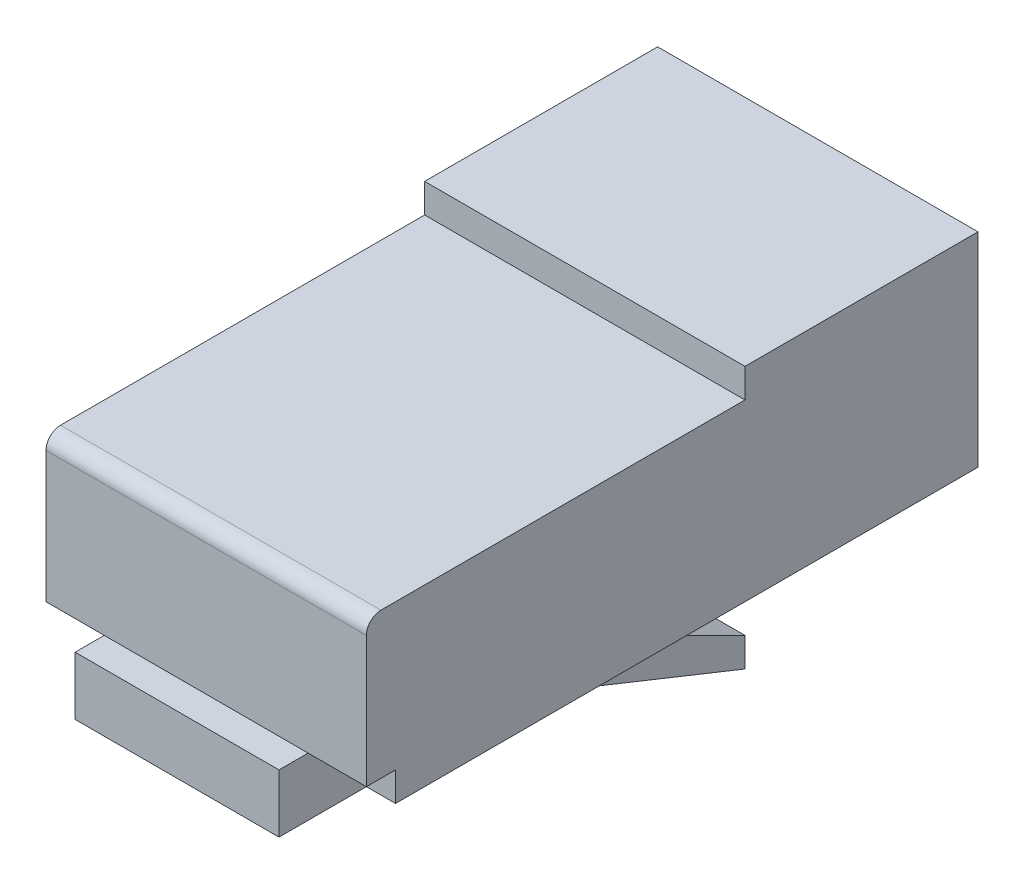
ISO-10303-21;
HEADER;
FILE_DESCRIPTION(('STEP AP214'),'2;1');
FILE_NAME('part.step','',(''),(''),'','','');
FILE_SCHEMA(('AUTOMOTIVE_DESIGN { 1 0 10303 214 1 1 1 1 }'));
ENDSEC;
DATA;
#1=APPLICATION_CONTEXT('core data for automotive mechanical design processes');
#2=APPLICATION_PROTOCOL_DEFINITION('international standard','automotive_design',2000,#1);
#3=PRODUCT_CONTEXT('',#1,'mechanical');
#4=PRODUCT('Part','Part','',(#3));
#5=PRODUCT_RELATED_PRODUCT_CATEGORY('part','',(#4));
#6=PRODUCT_DEFINITION_FORMATION('','',#4);
#7=PRODUCT_DEFINITION_CONTEXT('part definition',#1,'design');
#8=PRODUCT_DEFINITION('design','',#6,#7);
#9=PRODUCT_DEFINITION_SHAPE('','',#8);
#10=(LENGTH_UNIT() NAMED_UNIT(*) SI_UNIT(.MILLI.,.METRE.));
#11=(NAMED_UNIT(*) PLANE_ANGLE_UNIT() SI_UNIT($,.RADIAN.));
#12=(NAMED_UNIT(*) SI_UNIT($,.STERADIAN.) SOLID_ANGLE_UNIT());
#13=UNCERTAINTY_MEASURE_WITH_UNIT(LENGTH_MEASURE(1.E-05),#10,'distance_accuracy_value','');
#14=(GEOMETRIC_REPRESENTATION_CONTEXT(3) GLOBAL_UNCERTAINTY_ASSIGNED_CONTEXT((#13)) GLOBAL_UNIT_ASSIGNED_CONTEXT((#10,
#11,#12)) REPRESENTATION_CONTEXT('',''));
#15=CARTESIAN_POINT('',(0.,0.,0.));
#16=DIRECTION('',(0.,0.,1.));
#17=DIRECTION('',(1.,0.,0.));
#18=AXIS2_PLACEMENT_3D('',#15,#16,#17);
#19=CARTESIAN_POINT('',(2.,-0.5,-1.));
#20=DIRECTION('',(0.,0.,-1.));
#21=DIRECTION('',(-1.,0.,0.));
#22=AXIS2_PLACEMENT_3D('',#19,#20,#21);
#23=PLANE('',#22);
#24=DIRECTION('',(1.,0.,0.));
#25=VECTOR('',#24,1.);
#26=CARTESIAN_POINT('',(2.,-0.5,-1.));
#27=LINE('',#26,#25);
#28=CARTESIAN_POINT('',(2.,-0.5,-1.));
#29=VERTEX_POINT('',#28);
#30=CARTESIAN_POINT('',(3.,-0.5,-1.));
#31=VERTEX_POINT('',#30);
#32=EDGE_CURVE('E352',#29,#31,#27,.T.);
#33=ORIENTED_EDGE('',*,*,#32,.T.);
#34=DIRECTION('',(0.,-1.,0.));
#35=VECTOR('',#34,1.);
#36=CARTESIAN_POINT('',(3.,-2.,-1.));
#37=LINE('',#36,#35);
#38=CARTESIAN_POINT('',(3.,-2.,-1.));
#39=VERTEX_POINT('',#38);
#40=EDGE_CURVE('E272',#31,#39,#37,.T.);
#41=ORIENTED_EDGE('',*,*,#40,.T.);
#42=DIRECTION('',(1.,0.,0.));
#43=VECTOR('',#42,1.);
#44=CARTESIAN_POINT('',(2.,-2.,-1.));
#45=LINE('',#44,#43);
#46=CARTESIAN_POINT('',(2.,-2.,-1.));
#47=VERTEX_POINT('',#46);
#48=EDGE_CURVE('E358',#47,#39,#45,.T.);
#49=ORIENTED_EDGE('',*,*,#48,.F.);
#50=DIRECTION('',(0.,1.,0.));
#51=VECTOR('',#50,1.);
#52=CARTESIAN_POINT('',(2.,-0.5,-1.));
#53=LINE('',#52,#51);
#54=EDGE_CURVE('E333',#47,#29,#53,.T.);
#55=ORIENTED_EDGE('',*,*,#54,.T.);
#56=EDGE_LOOP('',(#33,#41,#49,#55));
#57=FACE_BOUND('',#56,.T.);
#58=ADVANCED_FACE('F35',(#57),#23,.T.);
#59=CARTESIAN_POINT('',(11.,0.,5.));
#60=DIRECTION('',(0.,1.,0.));
#61=DIRECTION('',(0.,0.,1.));
#62=AXIS2_PLACEMENT_3D('',#59,#60,#61);
#63=PLANE('',#62);
#64=DIRECTION('',(0.,0.,-1.));
#65=VECTOR('',#64,1.);
#66=CARTESIAN_POINT('',(2.,0.,5.));
#67=LINE('',#66,#65);
#68=CARTESIAN_POINT('',(2.,0.,4.));
#69=VERTEX_POINT('',#68);
#70=CARTESIAN_POINT('',(2.,0.,2.));
#71=VERTEX_POINT('',#70);
#72=EDGE_CURVE('E355',#69,#71,#67,.T.);
#73=ORIENTED_EDGE('',*,*,#72,.F.);
#74=DIRECTION('',(1.,0.,0.));
#75=VECTOR('',#74,1.);
#76=CARTESIAN_POINT('',(2.,0.,4.));
#77=LINE('',#76,#75);
#78=CARTESIAN_POINT('',(0.,0.,4.));
#79=VERTEX_POINT('',#78);
#80=EDGE_CURVE('E469',#79,#69,#77,.T.);
#81=ORIENTED_EDGE('',*,*,#80,.F.);
#82=DIRECTION('',(0.,0.,-1.));
#83=VECTOR('',#82,1.);
#84=CARTESIAN_POINT('',(0.,0.,5.));
#85=LINE('',#84,#83);
#86=CARTESIAN_POINT('',(0.,0.,-16.));
#87=VERTEX_POINT('',#86);
#88=EDGE_CURVE('E370',#79,#87,#85,.T.);
#89=ORIENTED_EDGE('',*,*,#88,.T.);
#90=DIRECTION('',(-1.,0.,0.));
#91=VECTOR('',#90,1.);
#92=CARTESIAN_POINT('',(11.,0.,-16.));
#93=LINE('',#92,#91);
#94=CARTESIAN_POINT('',(11.,0.,-16.));
#95=VERTEX_POINT('',#94);
#96=EDGE_CURVE('E447',#95,#87,#93,.T.);
#97=ORIENTED_EDGE('',*,*,#96,.F.);
#98=DIRECTION('',(0.,0.,-1.));
#99=VECTOR('',#98,1.);
#100=CARTESIAN_POINT('',(11.,0.,5.));
#101=LINE('',#100,#99);
#102=CARTESIAN_POINT('',(11.,0.,4.));
#103=VERTEX_POINT('',#102);
#104=EDGE_CURVE('E393',#103,#95,#101,.T.);
#105=ORIENTED_EDGE('',*,*,#104,.F.);
#106=DIRECTION('',(1.,0.,0.));
#107=VECTOR('',#106,1.);
#108=CARTESIAN_POINT('',(9.,0.,4.));
#109=LINE('',#108,#107);
#110=CARTESIAN_POINT('',(9.,0.,4.));
#111=VERTEX_POINT('',#110);
#112=EDGE_CURVE('E524',#111,#103,#109,.T.);
#113=ORIENTED_EDGE('',*,*,#112,.F.);
#114=DIRECTION('',(0.,0.,1.));
#115=VECTOR('',#114,1.);
#116=CARTESIAN_POINT('',(9.,0.,5.));
#117=LINE('',#116,#115);
#118=CARTESIAN_POINT('',(9.,0.,2.));
#119=VERTEX_POINT('',#118);
#120=EDGE_CURVE('E511',#119,#111,#117,.T.);
#121=ORIENTED_EDGE('',*,*,#120,.F.);
#122=DIRECTION('',(1.,0.,0.));
#123=VECTOR('',#122,1.);
#124=CARTESIAN_POINT('',(9.,0.,2.));
#125=LINE('',#124,#123);
#126=EDGE_CURVE('E515',#71,#119,#125,.T.);
#127=ORIENTED_EDGE('',*,*,#126,.F.);
#128=EDGE_LOOP('',(#73,#81,#89,#97,#105,#113,#121,#127));
#129=FACE_BOUND('',#128,.T.);
#130=ADVANCED_FACE('F462',(#129),#63,.F.);
#131=CARTESIAN_POINT('',(0.,0.,5.));
#132=DIRECTION('',(0.,0.,-1.));
#133=DIRECTION('',(-1.,0.,0.));
#134=AXIS2_PLACEMENT_3D('',#131,#132,#133);
#135=PLANE('',#134);
#136=DIRECTION('',(0.,1.,0.));
#137=VECTOR('',#136,1.);
#138=CARTESIAN_POINT('',(11.,6.,5.));
#139=LINE('',#138,#137);
#140=CARTESIAN_POINT('',(11.,1.,5.));
#141=VERTEX_POINT('',#140);
#142=CARTESIAN_POINT('',(11.,5.5,5.));
#143=VERTEX_POINT('',#142);
#144=EDGE_CURVE('E386',#141,#143,#139,.T.);
#145=ORIENTED_EDGE('',*,*,#144,.T.);
#146=DIRECTION('',(-1.,0.,0.));
#147=VECTOR('',#146,1.);
#148=CARTESIAN_POINT('',(0.,5.5,5.));
#149=LINE('',#148,#147);
#150=CARTESIAN_POINT('',(0.,5.5,5.));
#151=VERTEX_POINT('',#150);
#152=EDGE_CURVE('E371',#143,#151,#149,.T.);
#153=ORIENTED_EDGE('',*,*,#152,.T.);
#154=DIRECTION('',(0.,-1.,0.));
#155=VECTOR('',#154,1.);
#156=CARTESIAN_POINT('',(0.,6.,5.));
#157=LINE('',#156,#155);
#158=CARTESIAN_POINT('',(0.,1.,5.));
#159=VERTEX_POINT('',#158);
#160=EDGE_CURVE('E382',#151,#159,#157,.T.);
#161=ORIENTED_EDGE('',*,*,#160,.T.);
#162=DIRECTION('',(-1.,0.,0.));
#163=VECTOR('',#162,1.);
#164=CARTESIAN_POINT('',(2.,1.,5.));
#165=LINE('',#164,#163);
#166=CARTESIAN_POINT('',(2.,1.,5.));
#167=VERTEX_POINT('',#166);
#168=EDGE_CURVE('E478',#167,#159,#165,.T.);
#169=ORIENTED_EDGE('',*,*,#168,.F.);
#170=DIRECTION('',(-1.,0.,0.));
#171=VECTOR('',#170,1.);
#172=CARTESIAN_POINT('',(2.,1.,5.));
#173=LINE('',#172,#171);
#174=CARTESIAN_POINT('',(9.,1.,5.));
#175=VERTEX_POINT('',#174);
#176=EDGE_CURVE('E482',#175,#167,#173,.T.);
#177=ORIENTED_EDGE('',*,*,#176,.F.);
#178=DIRECTION('',(-1.,0.,0.));
#179=VECTOR('',#178,1.);
#180=CARTESIAN_POINT('',(9.,1.,5.));
#181=LINE('',#180,#179);
#182=EDGE_CURVE('E510',#141,#175,#181,.T.);
#183=ORIENTED_EDGE('',*,*,#182,.F.);
#184=EDGE_LOOP('',(#145,#153,#161,#169,#177,#183));
#185=FACE_BOUND('',#184,.T.);
#186=ADVANCED_FACE('F380',(#185),#135,.F.);
#187=CARTESIAN_POINT('',(11.,6.,5.));
#188=DIRECTION('',(-1.,0.,0.));
#189=DIRECTION('',(0.,0.,1.));
#190=AXIS2_PLACEMENT_3D('',#187,#188,#189);
#191=PLANE('',#190);
#192=DIRECTION('',(0.,0.,-1.));
#193=VECTOR('',#192,1.);
#194=CARTESIAN_POINT('',(11.,6.,5.));
#195=LINE('',#194,#193);
#196=CARTESIAN_POINT('',(11.,6.,4.5));
#197=VERTEX_POINT('',#196);
#198=CARTESIAN_POINT('',(11.,6.,-8.));
#199=VERTEX_POINT('',#198);
#200=EDGE_CURVE('E369',#197,#199,#195,.T.);
#201=ORIENTED_EDGE('',*,*,#200,.F.);
#202=CARTESIAN_POINT('',(11.,5.5,4.5));
#203=DIRECTION('',(-1.,0.,0.));
#204=DIRECTION('',(0.,0.,1.));
#205=AXIS2_PLACEMENT_3D('',#202,#203,#204);
#206=CIRCLE('',#205,0.5);
#207=EDGE_CURVE('E11',#197,#143,#206,.F.);
#208=ORIENTED_EDGE('',*,*,#207,.T.);
#209=ORIENTED_EDGE('',*,*,#144,.F.);
#210=DIRECTION('',(0.,0.,1.));
#211=VECTOR('',#210,1.);
#212=CARTESIAN_POINT('',(11.,1.,4.));
#213=LINE('',#212,#211);
#214=CARTESIAN_POINT('',(11.,1.,4.));
#215=VERTEX_POINT('',#214);
#216=EDGE_CURVE('E529',#215,#141,#213,.T.);
#217=ORIENTED_EDGE('',*,*,#216,.F.);
#218=DIRECTION('',(0.,1.,0.));
#219=VECTOR('',#218,1.);
#220=CARTESIAN_POINT('',(11.,0.,4.));
#221=LINE('',#220,#219);
#222=EDGE_CURVE('E459',#103,#215,#221,.T.);
#223=ORIENTED_EDGE('',*,*,#222,.F.);
#224=ORIENTED_EDGE('',*,*,#104,.T.);
#225=DIRECTION('',(0.,-1.,0.));
#226=VECTOR('',#225,1.);
#227=CARTESIAN_POINT('',(11.,0.,-16.));
#228=LINE('',#227,#226);
#229=CARTESIAN_POINT('',(11.,7.,-16.));
#230=VERTEX_POINT('',#229);
#231=EDGE_CURVE('E415',#230,#95,#228,.T.);
#232=ORIENTED_EDGE('',*,*,#231,.F.);
#233=DIRECTION('',(0.,0.,1.));
#234=VECTOR('',#233,1.);
#235=CARTESIAN_POINT('',(11.,7.,-16.));
#236=LINE('',#235,#234);
#237=CARTESIAN_POINT('',(11.,7.,-8.));
#238=VERTEX_POINT('',#237);
#239=EDGE_CURVE('E416',#230,#238,#236,.T.);
#240=ORIENTED_EDGE('',*,*,#239,.T.);
#241=DIRECTION('',(0.,-1.,0.));
#242=VECTOR('',#241,1.);
#243=CARTESIAN_POINT('',(11.,0.,-8.));
#244=LINE('',#243,#242);
#245=EDGE_CURVE('E407',#238,#199,#244,.T.);
#246=ORIENTED_EDGE('',*,*,#245,.T.);
#247=EDGE_LOOP('',(#201,#208,#209,#217,#223,#224,#232,#240,#246));
#248=FACE_BOUND('',#247,.T.);
#249=ADVANCED_FACE('F454',(#248),#191,.F.);
#250=CARTESIAN_POINT('',(11.,6.,5.));
#251=DIRECTION('',(0.,-1.,0.));
#252=DIRECTION('',(1.,0.,0.));
#253=AXIS2_PLACEMENT_3D('',#250,#251,#252);
#254=PLANE('',#253);
#255=DIRECTION('',(0.,0.,-1.));
#256=VECTOR('',#255,1.);
#257=CARTESIAN_POINT('',(0.,6.,5.));
#258=LINE('',#257,#256);
#259=CARTESIAN_POINT('',(0.,6.,4.5));
#260=VERTEX_POINT('',#259);
#261=CARTESIAN_POINT('',(0.,6.,-8.));
#262=VERTEX_POINT('',#261);
#263=EDGE_CURVE('E366',#260,#262,#258,.T.);
#264=ORIENTED_EDGE('',*,*,#263,.F.);
#265=DIRECTION('',(-1.,0.,0.));
#266=VECTOR('',#265,1.);
#267=CARTESIAN_POINT('',(11.,6.,4.5));
#268=LINE('',#267,#266);
#269=EDGE_CURVE('E43',#260,#197,#268,.F.);
#270=ORIENTED_EDGE('',*,*,#269,.T.);
#271=ORIENTED_EDGE('',*,*,#200,.T.);
#272=DIRECTION('',(1.,0.,0.));
#273=VECTOR('',#272,1.);
#274=CARTESIAN_POINT('',(11.,6.,-8.));
#275=LINE('',#274,#273);
#276=EDGE_CURVE('E396',#262,#199,#275,.T.);
#277=ORIENTED_EDGE('',*,*,#276,.F.);
#278=EDGE_LOOP('',(#264,#270,#271,#277));
#279=FACE_BOUND('',#278,.T.);
#280=ADVANCED_FACE('F717',(#279),#254,.F.);
#281=CARTESIAN_POINT('',(0.,6.,5.));
#282=DIRECTION('',(1.,0.,0.));
#283=DIRECTION('',(0.,1.,0.));
#284=AXIS2_PLACEMENT_3D('',#281,#282,#283);
#285=PLANE('',#284);
#286=ORIENTED_EDGE('',*,*,#160,.F.);
#287=CARTESIAN_POINT('',(0.,5.5,4.5));
#288=DIRECTION('',(1.,0.,0.));
#289=DIRECTION('',(0.,1.,0.));
#290=AXIS2_PLACEMENT_3D('',#287,#288,#289);
#291=CIRCLE('',#290,0.5);
#292=EDGE_CURVE('E57',#151,#260,#291,.F.);
#293=ORIENTED_EDGE('',*,*,#292,.T.);
#294=ORIENTED_EDGE('',*,*,#263,.T.);
#295=DIRECTION('',(0.,1.,0.));
#296=VECTOR('',#295,1.);
#297=CARTESIAN_POINT('',(0.,0.,-8.));
#298=LINE('',#297,#296);
#299=CARTESIAN_POINT('',(0.,7.,-8.));
#300=VERTEX_POINT('',#299);
#301=EDGE_CURVE('E403',#262,#300,#298,.T.);
#302=ORIENTED_EDGE('',*,*,#301,.T.);
#303=DIRECTION('',(0.,0.,1.));
#304=VECTOR('',#303,1.);
#305=CARTESIAN_POINT('',(0.,7.,-16.));
#306=LINE('',#305,#304);
#307=CARTESIAN_POINT('',(0.,7.,-16.));
#308=VERTEX_POINT('',#307);
#309=EDGE_CURVE('E400',#308,#300,#306,.T.);
#310=ORIENTED_EDGE('',*,*,#309,.F.);
#311=DIRECTION('',(0.,1.,0.));
#312=VECTOR('',#311,1.);
#313=CARTESIAN_POINT('',(0.,0.,-16.));
#314=LINE('',#313,#312);
#315=EDGE_CURVE('E450',#87,#308,#314,.T.);
#316=ORIENTED_EDGE('',*,*,#315,.F.);
#317=ORIENTED_EDGE('',*,*,#88,.F.);
#318=DIRECTION('',(0.,-1.,0.));
#319=VECTOR('',#318,1.);
#320=CARTESIAN_POINT('',(0.,1.,4.));
#321=LINE('',#320,#319);
#322=CARTESIAN_POINT('',(0.,1.,4.));
#323=VERTEX_POINT('',#322);
#324=EDGE_CURVE('E465',#323,#79,#321,.T.);
#325=ORIENTED_EDGE('',*,*,#324,.F.);
#326=DIRECTION('',(0.,0.,1.));
#327=VECTOR('',#326,1.);
#328=CARTESIAN_POINT('',(0.,1.,4.));
#329=LINE('',#328,#327);
#330=EDGE_CURVE('E392',#323,#159,#329,.T.);
#331=ORIENTED_EDGE('',*,*,#330,.T.);
#332=EDGE_LOOP('',(#286,#293,#294,#302,#310,#316,#317,#325,#331));
#333=FACE_BOUND('',#332,.T.);
#334=ADVANCED_FACE('F390',(#333),#285,.F.);
#335=CARTESIAN_POINT('',(11.,7.,-16.));
#336=DIRECTION('',(0.,-1.,0.));
#337=DIRECTION('',(0.,0.,-1.));
#338=AXIS2_PLACEMENT_3D('',#335,#336,#337);
#339=PLANE('',#338);
#340=DIRECTION('',(1.,0.,0.));
#341=VECTOR('',#340,1.);
#342=CARTESIAN_POINT('',(11.,7.,-8.));
#343=LINE('',#342,#341);
#344=EDGE_CURVE('E406',#300,#238,#343,.T.);
#345=ORIENTED_EDGE('',*,*,#344,.T.);
#346=ORIENTED_EDGE('',*,*,#239,.F.);
#347=DIRECTION('',(1.,0.,0.));
#348=VECTOR('',#347,1.);
#349=CARTESIAN_POINT('',(11.,7.,-16.));
#350=LINE('',#349,#348);
#351=EDGE_CURVE('E418',#308,#230,#350,.T.);
#352=ORIENTED_EDGE('',*,*,#351,.F.);
#353=ORIENTED_EDGE('',*,*,#309,.T.);
#354=EDGE_LOOP('',(#345,#346,#352,#353));
#355=FACE_BOUND('',#354,.T.);
#356=ADVANCED_FACE('F424',(#355),#339,.F.);
#357=CARTESIAN_POINT('',(0.,0.,-16.));
#358=DIRECTION('',(0.,0.,1.));
#359=DIRECTION('',(1.,0.,0.));
#360=AXIS2_PLACEMENT_3D('',#357,#358,#359);
#361=PLANE('',#360);
#362=DIRECTION('',(-1.,0.,0.));
#363=VECTOR('',#362,1.);
#364=CARTESIAN_POINT('',(9.,2.,-16.));
#365=LINE('',#364,#363);
#366=CARTESIAN_POINT('',(9.,2.,-16.));
#367=VERTEX_POINT('',#366);
#368=CARTESIAN_POINT('',(2.,2.,-16.));
#369=VERTEX_POINT('',#368);
#370=EDGE_CURVE('E257',#367,#369,#365,.T.);
#371=ORIENTED_EDGE('',*,*,#370,.F.);
#372=DIRECTION('',(0.,-1.,0.));
#373=VECTOR('',#372,1.);
#374=CARTESIAN_POINT('',(9.,2.,-16.));
#375=LINE('',#374,#373);
#376=CARTESIAN_POINT('',(9.,5.,-16.));
#377=VERTEX_POINT('',#376);
#378=EDGE_CURVE('E231',#377,#367,#375,.T.);
#379=ORIENTED_EDGE('',*,*,#378,.F.);
#380=DIRECTION('',(1.,0.,0.));
#381=VECTOR('',#380,1.);
#382=CARTESIAN_POINT('',(9.,5.,-16.));
#383=LINE('',#382,#381);
#384=CARTESIAN_POINT('',(2.,5.,-16.));
#385=VERTEX_POINT('',#384);
#386=EDGE_CURVE('E248',#385,#377,#383,.T.);
#387=ORIENTED_EDGE('',*,*,#386,.F.);
#388=DIRECTION('',(0.,1.,0.));
#389=VECTOR('',#388,1.);
#390=CARTESIAN_POINT('',(2.,2.,-16.));
#391=LINE('',#390,#389);
#392=EDGE_CURVE('E251',#369,#385,#391,.T.);
#393=ORIENTED_EDGE('',*,*,#392,.F.);
#394=EDGE_LOOP('',(#371,#379,#387,#393));
#395=FACE_BOUND('',#394,.T.);
#396=ORIENTED_EDGE('',*,*,#231,.T.);
#397=ORIENTED_EDGE('',*,*,#96,.T.);
#398=ORIENTED_EDGE('',*,*,#315,.T.);
#399=ORIENTED_EDGE('',*,*,#351,.T.);
#400=EDGE_LOOP('',(#396,#397,#398,#399));
#401=FACE_BOUND('',#400,.T.);
#402=ADVANCED_FACE('F452',(#395,#401),#361,.F.);
#403=CARTESIAN_POINT('',(0.,0.,-8.));
#404=DIRECTION('',(0.,0.,1.));
#405=DIRECTION('',(1.,0.,0.));
#406=AXIS2_PLACEMENT_3D('',#403,#404,#405);
#407=PLANE('',#406);
#408=ORIENTED_EDGE('',*,*,#301,.F.);
#409=ORIENTED_EDGE('',*,*,#276,.T.);
#410=ORIENTED_EDGE('',*,*,#245,.F.);
#411=ORIENTED_EDGE('',*,*,#344,.F.);
#412=EDGE_LOOP('',(#408,#409,#410,#411));
#413=FACE_BOUND('',#412,.T.);
#414=ADVANCED_FACE('F430',(#413),#407,.T.);
#415=CARTESIAN_POINT('',(2.,1.,6.));
#416=DIRECTION('',(0.,-1.,0.));
#417=DIRECTION('',(0.,0.,-1.));
#418=AXIS2_PLACEMENT_3D('',#415,#416,#417);
#419=PLANE('',#418);
#420=ORIENTED_EDGE('',*,*,#176,.T.);
#421=DIRECTION('',(0.,0.,-1.));
#422=VECTOR('',#421,1.);
#423=CARTESIAN_POINT('',(2.,1.,6.));
#424=LINE('',#423,#422);
#425=CARTESIAN_POINT('',(2.,1.,6.));
#426=VERTEX_POINT('',#425);
#427=EDGE_CURVE('E433',#426,#167,#424,.T.);
#428=ORIENTED_EDGE('',*,*,#427,.F.);
#429=DIRECTION('',(-1.,0.,0.));
#430=VECTOR('',#429,1.);
#431=CARTESIAN_POINT('',(2.,1.,6.));
#432=LINE('',#431,#430);
#433=CARTESIAN_POINT('',(9.,1.,6.));
#434=VERTEX_POINT('',#433);
#435=EDGE_CURVE('E484',#434,#426,#432,.T.);
#436=ORIENTED_EDGE('',*,*,#435,.F.);
#437=DIRECTION('',(0.,0.,-1.));
#438=VECTOR('',#437,1.);
#439=CARTESIAN_POINT('',(9.,1.,6.));
#440=LINE('',#439,#438);
#441=EDGE_CURVE('E493',#434,#175,#440,.T.);
#442=ORIENTED_EDGE('',*,*,#441,.T.);
#443=EDGE_LOOP('',(#420,#428,#436,#442));
#444=FACE_BOUND('',#443,.T.);
#445=ADVANCED_FACE('F545',(#444),#419,.F.);
#446=CARTESIAN_POINT('',(2.,-1.,6.));
#447=DIRECTION('',(1.,0.,0.));
#448=DIRECTION('',(0.,0.,-1.));
#449=AXIS2_PLACEMENT_3D('',#446,#447,#448);
#450=PLANE('',#449);
#451=ORIENTED_EDGE('',*,*,#427,.T.);
#452=DIRECTION('',(0.,0.,1.));
#453=VECTOR('',#452,1.);
#454=CARTESIAN_POINT('',(2.,1.,4.));
#455=LINE('',#454,#453);
#456=CARTESIAN_POINT('',(2.,1.,4.));
#457=VERTEX_POINT('',#456);
#458=EDGE_CURVE('E472',#457,#167,#455,.T.);
#459=ORIENTED_EDGE('',*,*,#458,.F.);
#460=DIRECTION('',(0.,1.,0.));
#461=VECTOR('',#460,1.);
#462=CARTESIAN_POINT('',(2.,1.,4.));
#463=LINE('',#462,#461);
#464=EDGE_CURVE('E474',#69,#457,#463,.T.);
#465=ORIENTED_EDGE('',*,*,#464,.F.);
#466=ORIENTED_EDGE('',*,*,#72,.T.);
#467=DIRECTION('',(0.,0.164398987305357,0.986393923832144));
#468=VECTOR('',#467,1.);
#469=CARTESIAN_POINT('',(2.,0.,2.));
#470=LINE('',#469,#468);
#471=EDGE_CURVE('E336',#29,#71,#470,.T.);
#472=ORIENTED_EDGE('',*,*,#471,.F.);
#473=ORIENTED_EDGE('',*,*,#54,.F.);
#474=DIRECTION('',(0.,-0.447213595499958,-0.894427190999916));
#475=VECTOR('',#474,1.);
#476=CARTESIAN_POINT('',(2.,-2.,-1.));
#477=LINE('',#476,#475);
#478=CARTESIAN_POINT('',(2.,-1.5,0.));
#479=VERTEX_POINT('',#478);
#480=EDGE_CURVE('E329',#479,#47,#477,.T.);
#481=ORIENTED_EDGE('',*,*,#480,.F.);
#482=DIRECTION('',(0.,-0.242535625036333,-0.970142500145332));
#483=VECTOR('',#482,1.);
#484=CARTESIAN_POINT('',(2.,-1.5,0.));
#485=LINE('',#484,#483);
#486=CARTESIAN_POINT('',(2.,-1.,2.));
#487=VERTEX_POINT('',#486);
#488=EDGE_CURVE('E326',#487,#479,#485,.T.);
#489=ORIENTED_EDGE('',*,*,#488,.F.);
#490=DIRECTION('',(0.,0.,-1.));
#491=VECTOR('',#490,1.);
#492=CARTESIAN_POINT('',(2.,-1.,6.));
#493=LINE('',#492,#491);
#494=CARTESIAN_POINT('',(2.,-1.,6.));
#495=VERTEX_POINT('',#494);
#496=EDGE_CURVE('E435',#495,#487,#493,.T.);
#497=ORIENTED_EDGE('',*,*,#496,.F.);
#498=DIRECTION('',(0.,-1.,0.));
#499=VECTOR('',#498,1.);
#500=CARTESIAN_POINT('',(2.,-1.,6.));
#501=LINE('',#500,#499);
#502=EDGE_CURVE('E487',#426,#495,#501,.T.);
#503=ORIENTED_EDGE('',*,*,#502,.F.);
#504=EDGE_LOOP('',(#451,#459,#465,#466,#472,#473,#481,#489,#497,#503));
#505=FACE_BOUND('',#504,.T.);
#506=ADVANCED_FACE('F537',(#505),#450,.F.);
#507=CARTESIAN_POINT('',(9.,-1.,6.));
#508=DIRECTION('',(0.,1.,0.));
#509=DIRECTION('',(-1.,0.,0.));
#510=AXIS2_PLACEMENT_3D('',#507,#508,#509);
#511=PLANE('',#510);
#512=ORIENTED_EDGE('',*,*,#496,.T.);
#513=DIRECTION('',(1.,0.,0.));
#514=VECTOR('',#513,1.);
#515=CARTESIAN_POINT('',(9.,-1.,2.));
#516=LINE('',#515,#514);
#517=CARTESIAN_POINT('',(9.,-1.,2.));
#518=VERTEX_POINT('',#517);
#519=EDGE_CURVE('E505',#487,#518,#516,.T.);
#520=ORIENTED_EDGE('',*,*,#519,.T.);
#521=DIRECTION('',(0.,0.,-1.));
#522=VECTOR('',#521,1.);
#523=CARTESIAN_POINT('',(9.,-1.,6.));
#524=LINE('',#523,#522);
#525=CARTESIAN_POINT('',(9.,-1.,6.));
#526=VERTEX_POINT('',#525);
#527=EDGE_CURVE('E441',#526,#518,#524,.T.);
#528=ORIENTED_EDGE('',*,*,#527,.F.);
#529=DIRECTION('',(1.,0.,0.));
#530=VECTOR('',#529,1.);
#531=CARTESIAN_POINT('',(9.,-1.,6.));
#532=LINE('',#531,#530);
#533=EDGE_CURVE('E489',#495,#526,#532,.T.);
#534=ORIENTED_EDGE('',*,*,#533,.F.);
#535=EDGE_LOOP('',(#512,#520,#528,#534));
#536=FACE_BOUND('',#535,.T.);
#537=ADVANCED_FACE('F506',(#536),#511,.F.);
#538=CARTESIAN_POINT('',(9.,1.,6.));
#539=DIRECTION('',(-1.,0.,0.));
#540=DIRECTION('',(0.,0.,1.));
#541=AXIS2_PLACEMENT_3D('',#538,#539,#540);
#542=PLANE('',#541);
#543=ORIENTED_EDGE('',*,*,#527,.T.);
#544=DIRECTION('',(0.,-0.242535625036333,-0.970142500145332));
#545=VECTOR('',#544,1.);
#546=CARTESIAN_POINT('',(9.,-1.5,0.));
#547=LINE('',#546,#545);
#548=CARTESIAN_POINT('',(9.,-1.5,0.));
#549=VERTEX_POINT('',#548);
#550=EDGE_CURVE('E294',#518,#549,#547,.T.);
#551=ORIENTED_EDGE('',*,*,#550,.T.);
#552=DIRECTION('',(0.,-0.447213595499958,-0.894427190999916));
#553=VECTOR('',#552,1.);
#554=CARTESIAN_POINT('',(9.,-2.,-1.));
#555=LINE('',#554,#553);
#556=CARTESIAN_POINT('',(9.,-2.,-1.));
#557=VERTEX_POINT('',#556);
#558=EDGE_CURVE('E341',#549,#557,#555,.T.);
#559=ORIENTED_EDGE('',*,*,#558,.T.);
#560=DIRECTION('',(0.,1.,0.));
#561=VECTOR('',#560,1.);
#562=CARTESIAN_POINT('',(9.,-0.5,-1.));
#563=LINE('',#562,#561);
#564=CARTESIAN_POINT('',(9.,-0.5,-1.));
#565=VERTEX_POINT('',#564);
#566=EDGE_CURVE('E344',#557,#565,#563,.T.);
#567=ORIENTED_EDGE('',*,*,#566,.T.);
#568=DIRECTION('',(0.,0.164398987305357,0.986393923832144));
#569=VECTOR('',#568,1.);
#570=CARTESIAN_POINT('',(9.,0.,2.));
#571=LINE('',#570,#569);
#572=EDGE_CURVE('E330',#565,#119,#571,.T.);
#573=ORIENTED_EDGE('',*,*,#572,.T.);
#574=ORIENTED_EDGE('',*,*,#120,.T.);
#575=DIRECTION('',(0.,-1.,0.));
#576=VECTOR('',#575,1.);
#577=CARTESIAN_POINT('',(9.,0.,4.));
#578=LINE('',#577,#576);
#579=CARTESIAN_POINT('',(9.,1.,4.));
#580=VERTEX_POINT('',#579);
#581=EDGE_CURVE('E513',#580,#111,#578,.T.);
#582=ORIENTED_EDGE('',*,*,#581,.F.);
#583=DIRECTION('',(0.,0.,1.));
#584=VECTOR('',#583,1.);
#585=CARTESIAN_POINT('',(9.,1.,4.));
#586=LINE('',#585,#584);
#587=EDGE_CURVE('E480',#580,#175,#586,.T.);
#588=ORIENTED_EDGE('',*,*,#587,.T.);
#589=ORIENTED_EDGE('',*,*,#441,.F.);
#590=DIRECTION('',(0.,1.,0.));
#591=VECTOR('',#590,1.);
#592=CARTESIAN_POINT('',(9.,1.,6.));
#593=LINE('',#592,#591);
#594=EDGE_CURVE('E491',#526,#434,#593,.T.);
#595=ORIENTED_EDGE('',*,*,#594,.F.);
#596=EDGE_LOOP('',(#543,#551,#559,#567,#573,#574,#582,#588,#589,#595));
#597=FACE_BOUND('',#596,.T.);
#598=ADVANCED_FACE('F501',(#597),#542,.F.);
#599=CARTESIAN_POINT('',(0.,0.,6.));
#600=DIRECTION('',(0.,0.,-1.));
#601=DIRECTION('',(-1.,0.,0.));
#602=AXIS2_PLACEMENT_3D('',#599,#600,#601);
#603=PLANE('',#602);
#604=ORIENTED_EDGE('',*,*,#435,.T.);
#605=ORIENTED_EDGE('',*,*,#502,.T.);
#606=ORIENTED_EDGE('',*,*,#533,.T.);
#607=ORIENTED_EDGE('',*,*,#594,.T.);
#608=EDGE_LOOP('',(#604,#605,#606,#607));
#609=FACE_BOUND('',#608,.T.);
#610=ADVANCED_FACE('F751',(#609),#603,.F.);
#611=CARTESIAN_POINT('',(2.,1.,4.));
#612=DIRECTION('',(0.,1.,0.));
#613=DIRECTION('',(0.,0.,1.));
#614=AXIS2_PLACEMENT_3D('',#611,#612,#613);
#615=PLANE('',#614);
#616=ORIENTED_EDGE('',*,*,#168,.T.);
#617=ORIENTED_EDGE('',*,*,#330,.F.);
#618=DIRECTION('',(-1.,0.,0.));
#619=VECTOR('',#618,1.);
#620=CARTESIAN_POINT('',(2.,1.,4.));
#621=LINE('',#620,#619);
#622=EDGE_CURVE('E470',#457,#323,#621,.T.);
#623=ORIENTED_EDGE('',*,*,#622,.F.);
#624=ORIENTED_EDGE('',*,*,#458,.T.);
#625=EDGE_LOOP('',(#616,#617,#623,#624));
#626=FACE_BOUND('',#625,.T.);
#627=ADVANCED_FACE('F541',(#626),#615,.F.);
#628=CARTESIAN_POINT('',(0.,0.,4.));
#629=DIRECTION('',(0.,0.,-1.));
#630=DIRECTION('',(-1.,0.,0.));
#631=AXIS2_PLACEMENT_3D('',#628,#629,#630);
#632=PLANE('',#631);
#633=ORIENTED_EDGE('',*,*,#464,.T.);
#634=ORIENTED_EDGE('',*,*,#622,.T.);
#635=ORIENTED_EDGE('',*,*,#324,.T.);
#636=ORIENTED_EDGE('',*,*,#80,.T.);
#637=EDGE_LOOP('',(#633,#634,#635,#636));
#638=FACE_BOUND('',#637,.T.);
#639=ADVANCED_FACE('F535',(#638),#632,.F.);
#640=CARTESIAN_POINT('',(9.,1.,4.));
#641=DIRECTION('',(0.,1.,0.));
#642=DIRECTION('',(0.,0.,1.));
#643=AXIS2_PLACEMENT_3D('',#640,#641,#642);
#644=PLANE('',#643);
#645=ORIENTED_EDGE('',*,*,#182,.T.);
#646=ORIENTED_EDGE('',*,*,#587,.F.);
#647=DIRECTION('',(-1.,0.,0.));
#648=VECTOR('',#647,1.);
#649=CARTESIAN_POINT('',(9.,1.,4.));
#650=LINE('',#649,#648);
#651=EDGE_CURVE('E527',#215,#580,#650,.T.);
#652=ORIENTED_EDGE('',*,*,#651,.F.);
#653=ORIENTED_EDGE('',*,*,#216,.T.);
#654=EDGE_LOOP('',(#645,#646,#652,#653));
#655=FACE_BOUND('',#654,.T.);
#656=ADVANCED_FACE('F549',(#655),#644,.F.);
#657=CARTESIAN_POINT('',(0.,0.,4.));
#658=DIRECTION('',(0.,0.,-1.));
#659=DIRECTION('',(-1.,0.,0.));
#660=AXIS2_PLACEMENT_3D('',#657,#658,#659);
#661=PLANE('',#660);
#662=ORIENTED_EDGE('',*,*,#581,.T.);
#663=ORIENTED_EDGE('',*,*,#112,.T.);
#664=ORIENTED_EDGE('',*,*,#222,.T.);
#665=ORIENTED_EDGE('',*,*,#651,.T.);
#666=EDGE_LOOP('',(#662,#663,#664,#665));
#667=FACE_BOUND('',#666,.T.);
#668=ADVANCED_FACE('F576',(#667),#661,.F.);
#669=CARTESIAN_POINT('',(2.,0.,2.));
#670=DIRECTION('',(0.,0.986393923832144,-0.164398987305357));
#671=DIRECTION('',(0.,0.164398987305357,0.986393923832144));
#672=AXIS2_PLACEMENT_3D('',#669,#670,#671);
#673=PLANE('',#672);
#674=ORIENTED_EDGE('',*,*,#572,.F.);
#675=CARTESIAN_POINT('',(8.,-0.5,-1.));
#676=VERTEX_POINT('',#675);
#677=EDGE_CURVE('E278',#676,#565,#27,.T.);
#678=ORIENTED_EDGE('',*,*,#677,.F.);
#679=DIRECTION('',(1.,0.,0.));
#680=VECTOR('',#679,1.);
#681=CARTESIAN_POINT('',(3.,-0.5,-1.));
#682=LINE('',#681,#680);
#683=EDGE_CURVE('E292',#31,#676,#682,.T.);
#684=ORIENTED_EDGE('',*,*,#683,.F.);
#685=ORIENTED_EDGE('',*,*,#32,.F.);
#686=ORIENTED_EDGE('',*,*,#471,.T.);
#687=ORIENTED_EDGE('',*,*,#126,.T.);
#688=EDGE_LOOP('',(#674,#678,#684,#685,#686,#687));
#689=FACE_BOUND('',#688,.T.);
#690=ADVANCED_FACE('F569',(#689),#673,.T.);
#691=DIRECTION('',(0.,-1.,0.));
#692=VECTOR('',#691,1.);
#693=CARTESIAN_POINT('',(8.,-2.,-1.));
#694=LINE('',#693,#692);
#695=CARTESIAN_POINT('',(8.,-2.,-1.));
#696=VERTEX_POINT('',#695);
#697=EDGE_CURVE('E263',#676,#696,#694,.T.);
#698=ORIENTED_EDGE('',*,*,#697,.F.);
#699=ORIENTED_EDGE('',*,*,#677,.T.);
#700=ORIENTED_EDGE('',*,*,#566,.F.);
#701=EDGE_CURVE('E356',#696,#557,#45,.T.);
#702=ORIENTED_EDGE('',*,*,#701,.F.);
#703=EDGE_LOOP('',(#698,#699,#700,#702));
#704=FACE_BOUND('',#703,.T.);
#705=ADVANCED_FACE('F558',(#704),#23,.T.);
#706=CARTESIAN_POINT('',(2.,-2.,-1.));
#707=DIRECTION('',(0.,-0.894427190999916,0.447213595499958));
#708=DIRECTION('',(0.,-0.447213595499958,-0.894427190999916));
#709=AXIS2_PLACEMENT_3D('',#706,#707,#708);
#710=PLANE('',#709);
#711=ORIENTED_EDGE('',*,*,#558,.F.);
#712=DIRECTION('',(1.,0.,0.));
#713=VECTOR('',#712,1.);
#714=CARTESIAN_POINT('',(2.,-1.5,0.));
#715=LINE('',#714,#713);
#716=EDGE_CURVE('E338',#479,#549,#715,.T.);
#717=ORIENTED_EDGE('',*,*,#716,.F.);
#718=ORIENTED_EDGE('',*,*,#480,.T.);
#719=ORIENTED_EDGE('',*,*,#48,.T.);
#720=DIRECTION('',(1.,0.,0.));
#721=VECTOR('',#720,1.);
#722=CARTESIAN_POINT('',(3.,-2.,-1.));
#723=LINE('',#722,#721);
#724=EDGE_CURVE('E285',#39,#696,#723,.T.);
#725=ORIENTED_EDGE('',*,*,#724,.T.);
#726=ORIENTED_EDGE('',*,*,#701,.T.);
#727=EDGE_LOOP('',(#711,#717,#718,#719,#725,#726));
#728=FACE_BOUND('',#727,.T.);
#729=ADVANCED_FACE('F568',(#728),#710,.T.);
#730=CARTESIAN_POINT('',(2.,-1.5,0.));
#731=DIRECTION('',(0.,-0.970142500145332,0.242535625036333));
#732=DIRECTION('',(0.,-0.242535625036333,-0.970142500145332));
#733=AXIS2_PLACEMENT_3D('',#730,#731,#732);
#734=PLANE('',#733);
#735=ORIENTED_EDGE('',*,*,#550,.F.);
#736=ORIENTED_EDGE('',*,*,#519,.F.);
#737=ORIENTED_EDGE('',*,*,#488,.T.);
#738=ORIENTED_EDGE('',*,*,#716,.T.);
#739=EDGE_LOOP('',(#735,#736,#737,#738));
#740=FACE_BOUND('',#739,.T.);
#741=ADVANCED_FACE('F574',(#740),#734,.T.);
#742=CARTESIAN_POINT('',(3.,-0.5,-1.));
#743=DIRECTION('',(0.,0.98058067569092,-0.196116135138184));
#744=DIRECTION('',(0.,0.196116135138184,0.98058067569092));
#745=AXIS2_PLACEMENT_3D('',#742,#743,#744);
#746=PLANE('',#745);
#747=DIRECTION('',(0.,0.196116135138184,0.98058067569092));
#748=VECTOR('',#747,1.);
#749=CARTESIAN_POINT('',(8.,-0.5,-1.));
#750=LINE('',#749,#748);
#751=CARTESIAN_POINT('',(8.,-1.5,-6.));
#752=VERTEX_POINT('',#751);
#753=EDGE_CURVE('E277',#752,#676,#750,.T.);
#754=ORIENTED_EDGE('',*,*,#753,.F.);
#755=DIRECTION('',(1.,0.,0.));
#756=VECTOR('',#755,1.);
#757=CARTESIAN_POINT('',(3.,-1.5,-6.));
#758=LINE('',#757,#756);
#759=CARTESIAN_POINT('',(3.,-1.5,-6.));
#760=VERTEX_POINT('',#759);
#761=EDGE_CURVE('E295',#760,#752,#758,.T.);
#762=ORIENTED_EDGE('',*,*,#761,.F.);
#763=DIRECTION('',(0.,0.196116135138184,0.98058067569092));
#764=VECTOR('',#763,1.);
#765=CARTESIAN_POINT('',(3.,-0.5,-1.));
#766=LINE('',#765,#764);
#767=EDGE_CURVE('E289',#760,#31,#766,.T.);
#768=ORIENTED_EDGE('',*,*,#767,.T.);
#769=ORIENTED_EDGE('',*,*,#683,.T.);
#770=EDGE_LOOP('',(#754,#762,#768,#769));
#771=FACE_BOUND('',#770,.T.);
#772=ADVANCED_FACE('F601',(#771),#746,.T.);
#773=CARTESIAN_POINT('',(3.,-1.5,-6.));
#774=DIRECTION('',(0.,0.894427190999916,-0.447213595499958));
#775=DIRECTION('',(0.,0.447213595499958,0.894427190999916));
#776=AXIS2_PLACEMENT_3D('',#773,#774,#775);
#777=PLANE('',#776);
#778=DIRECTION('',(0.,0.447213595499958,0.894427190999916));
#779=VECTOR('',#778,1.);
#780=CARTESIAN_POINT('',(8.,-1.5,-6.));
#781=LINE('',#780,#779);
#782=CARTESIAN_POINT('',(8.,-4.,-11.));
#783=VERTEX_POINT('',#782);
#784=EDGE_CURVE('E317',#783,#752,#781,.T.);
#785=ORIENTED_EDGE('',*,*,#784,.F.);
#786=DIRECTION('',(1.,0.,0.));
#787=VECTOR('',#786,1.);
#788=CARTESIAN_POINT('',(3.,-4.,-11.));
#789=LINE('',#788,#787);
#790=CARTESIAN_POINT('',(3.,-4.,-11.));
#791=VERTEX_POINT('',#790);
#792=EDGE_CURVE('E321',#791,#783,#789,.T.);
#793=ORIENTED_EDGE('',*,*,#792,.F.);
#794=DIRECTION('',(0.,0.447213595499958,0.894427190999916));
#795=VECTOR('',#794,1.);
#796=CARTESIAN_POINT('',(3.,-1.5,-6.));
#797=LINE('',#796,#795);
#798=EDGE_CURVE('E300',#791,#760,#797,.T.);
#799=ORIENTED_EDGE('',*,*,#798,.T.);
#800=ORIENTED_EDGE('',*,*,#761,.T.);
#801=EDGE_LOOP('',(#785,#793,#799,#800));
#802=FACE_BOUND('',#801,.T.);
#803=ADVANCED_FACE('F605',(#802),#777,.T.);
#804=CARTESIAN_POINT('',(3.,-4.,-11.));
#805=DIRECTION('',(0.,0.,-1.));
#806=DIRECTION('',(-1.,0.,0.));
#807=AXIS2_PLACEMENT_3D('',#804,#805,#806);
#808=PLANE('',#807);
#809=DIRECTION('',(0.,1.,0.));
#810=VECTOR('',#809,1.);
#811=CARTESIAN_POINT('',(8.,-4.,-11.));
#812=LINE('',#811,#810);
#813=CARTESIAN_POINT('',(8.,-5.,-11.));
#814=VERTEX_POINT('',#813);
#815=EDGE_CURVE('E314',#814,#783,#812,.T.);
#816=ORIENTED_EDGE('',*,*,#815,.F.);
#817=DIRECTION('',(1.,0.,0.));
#818=VECTOR('',#817,1.);
#819=CARTESIAN_POINT('',(3.,-5.,-11.));
#820=LINE('',#819,#818);
#821=CARTESIAN_POINT('',(3.,-5.,-11.));
#822=VERTEX_POINT('',#821);
#823=EDGE_CURVE('E323',#822,#814,#820,.T.);
#824=ORIENTED_EDGE('',*,*,#823,.F.);
#825=DIRECTION('',(0.,1.,0.));
#826=VECTOR('',#825,1.);
#827=CARTESIAN_POINT('',(3.,-4.,-11.));
#828=LINE('',#827,#826);
#829=EDGE_CURVE('E608',#822,#791,#828,.T.);
#830=ORIENTED_EDGE('',*,*,#829,.T.);
#831=ORIENTED_EDGE('',*,*,#792,.T.);
#832=EDGE_LOOP('',(#816,#824,#830,#831));
#833=FACE_BOUND('',#832,.T.);
#834=ADVANCED_FACE('F633',(#833),#808,.T.);
#835=CARTESIAN_POINT('',(3.,-5.,-11.));
#836=DIRECTION('',(0.,-0.928476690885259,0.371390676354104));
#837=DIRECTION('',(0.,-0.371390676354104,-0.928476690885259));
#838=AXIS2_PLACEMENT_3D('',#835,#836,#837);
#839=PLANE('',#838);
#840=DIRECTION('',(0.,-0.371390676354104,-0.928476690885259));
#841=VECTOR('',#840,1.);
#842=CARTESIAN_POINT('',(8.,-5.,-11.));
#843=LINE('',#842,#841);
#844=CARTESIAN_POINT('',(8.,-3.,-6.));
#845=VERTEX_POINT('',#844);
#846=EDGE_CURVE('E311',#845,#814,#843,.T.);
#847=ORIENTED_EDGE('',*,*,#846,.F.);
#848=DIRECTION('',(1.,0.,0.));
#849=VECTOR('',#848,1.);
#850=CARTESIAN_POINT('',(3.,-3.,-6.));
#851=LINE('',#850,#849);
#852=CARTESIAN_POINT('',(3.,-3.,-6.));
#853=VERTEX_POINT('',#852);
#854=EDGE_CURVE('E288',#853,#845,#851,.T.);
#855=ORIENTED_EDGE('',*,*,#854,.F.);
#856=DIRECTION('',(0.,-0.371390676354104,-0.928476690885259));
#857=VECTOR('',#856,1.);
#858=CARTESIAN_POINT('',(3.,-5.,-11.));
#859=LINE('',#858,#857);
#860=EDGE_CURVE('E269',#853,#822,#859,.T.);
#861=ORIENTED_EDGE('',*,*,#860,.T.);
#862=ORIENTED_EDGE('',*,*,#823,.T.);
#863=EDGE_LOOP('',(#847,#855,#861,#862));
#864=FACE_BOUND('',#863,.T.);
#865=ADVANCED_FACE('F613',(#864),#839,.T.);
#866=CARTESIAN_POINT('',(3.,-3.,-6.));
#867=DIRECTION('',(0.,-0.98058067569092,0.196116135138184));
#868=DIRECTION('',(0.,-0.196116135138184,-0.98058067569092));
#869=AXIS2_PLACEMENT_3D('',#866,#867,#868);
#870=PLANE('',#869);
#871=DIRECTION('',(0.,-0.196116135138184,-0.98058067569092));
#872=VECTOR('',#871,1.);
#873=CARTESIAN_POINT('',(8.,-3.,-6.));
#874=LINE('',#873,#872);
#875=EDGE_CURVE('E306',#696,#845,#874,.T.);
#876=ORIENTED_EDGE('',*,*,#875,.F.);
#877=ORIENTED_EDGE('',*,*,#724,.F.);
#878=DIRECTION('',(0.,-0.196116135138184,-0.98058067569092));
#879=VECTOR('',#878,1.);
#880=CARTESIAN_POINT('',(3.,-3.,-6.));
#881=LINE('',#880,#879);
#882=EDGE_CURVE('E276',#39,#853,#881,.T.);
#883=ORIENTED_EDGE('',*,*,#882,.T.);
#884=ORIENTED_EDGE('',*,*,#854,.T.);
#885=EDGE_LOOP('',(#876,#877,#883,#884));
#886=FACE_BOUND('',#885,.T.);
#887=ADVANCED_FACE('F592',(#886),#870,.T.);
#888=CARTESIAN_POINT('',(3.,0.,0.));
#889=DIRECTION('',(-1.,0.,0.));
#890=DIRECTION('',(0.,0.,1.));
#891=AXIS2_PLACEMENT_3D('',#888,#889,#890);
#892=PLANE('',#891);
#893=ORIENTED_EDGE('',*,*,#40,.F.);
#894=ORIENTED_EDGE('',*,*,#767,.F.);
#895=ORIENTED_EDGE('',*,*,#798,.F.);
#896=ORIENTED_EDGE('',*,*,#829,.F.);
#897=ORIENTED_EDGE('',*,*,#860,.F.);
#898=ORIENTED_EDGE('',*,*,#882,.F.);
#899=EDGE_LOOP('',(#893,#894,#895,#896,#897,#898));
#900=FACE_BOUND('',#899,.T.);
#901=ADVANCED_FACE('F596',(#900),#892,.T.);
#902=CARTESIAN_POINT('',(8.,0.,0.));
#903=DIRECTION('',(-1.,0.,0.));
#904=DIRECTION('',(0.,0.,1.));
#905=AXIS2_PLACEMENT_3D('',#902,#903,#904);
#906=PLANE('',#905);
#907=ORIENTED_EDGE('',*,*,#697,.T.);
#908=ORIENTED_EDGE('',*,*,#875,.T.);
#909=ORIENTED_EDGE('',*,*,#846,.T.);
#910=ORIENTED_EDGE('',*,*,#815,.T.);
#911=ORIENTED_EDGE('',*,*,#784,.T.);
#912=ORIENTED_EDGE('',*,*,#753,.T.);
#913=EDGE_LOOP('',(#907,#908,#909,#910,#911,#912));
#914=FACE_BOUND('',#913,.T.);
#915=ADVANCED_FACE('F615',(#914),#906,.F.);
#916=CARTESIAN_POINT('',(9.,2.,-8.));
#917=DIRECTION('',(1.,0.,0.));
#918=DIRECTION('',(0.,0.,-1.));
#919=AXIS2_PLACEMENT_3D('',#916,#917,#918);
#920=PLANE('',#919);
#921=ORIENTED_EDGE('',*,*,#378,.T.);
#922=DIRECTION('',(0.,0.,-1.));
#923=VECTOR('',#922,1.);
#924=CARTESIAN_POINT('',(9.,2.,-8.));
#925=LINE('',#924,#923);
#926=CARTESIAN_POINT('',(9.,2.,-8.));
#927=VERTEX_POINT('',#926);
#928=EDGE_CURVE('E224',#927,#367,#925,.T.);
#929=ORIENTED_EDGE('',*,*,#928,.F.);
#930=DIRECTION('',(0.,-1.,0.));
#931=VECTOR('',#930,1.);
#932=CARTESIAN_POINT('',(9.,2.,-8.));
#933=LINE('',#932,#931);
#934=CARTESIAN_POINT('',(9.,5.,-8.));
#935=VERTEX_POINT('',#934);
#936=EDGE_CURVE('E228',#935,#927,#933,.T.);
#937=ORIENTED_EDGE('',*,*,#936,.F.);
#938=DIRECTION('',(0.,0.,-1.));
#939=VECTOR('',#938,1.);
#940=CARTESIAN_POINT('',(9.,5.,-8.));
#941=LINE('',#940,#939);
#942=EDGE_CURVE('E261',#935,#377,#941,.T.);
#943=ORIENTED_EDGE('',*,*,#942,.T.);
#944=EDGE_LOOP('',(#921,#929,#937,#943));
#945=FACE_BOUND('',#944,.T.);
#946=ADVANCED_FACE('F226',(#945),#920,.F.);
#947=CARTESIAN_POINT('',(9.,5.,-8.));
#948=DIRECTION('',(0.,1.,0.));
#949=DIRECTION('',(0.,0.,1.));
#950=AXIS2_PLACEMENT_3D('',#947,#948,#949);
#951=PLANE('',#950);
#952=ORIENTED_EDGE('',*,*,#386,.T.);
#953=ORIENTED_EDGE('',*,*,#942,.F.);
#954=DIRECTION('',(1.,0.,0.));
#955=VECTOR('',#954,1.);
#956=CARTESIAN_POINT('',(9.,5.,-8.));
#957=LINE('',#956,#955);
#958=CARTESIAN_POINT('',(2.,5.,-8.));
#959=VERTEX_POINT('',#958);
#960=EDGE_CURVE('E236',#959,#935,#957,.T.);
#961=ORIENTED_EDGE('',*,*,#960,.F.);
#962=DIRECTION('',(0.,0.,-1.));
#963=VECTOR('',#962,1.);
#964=CARTESIAN_POINT('',(2.,5.,-8.));
#965=LINE('',#964,#963);
#966=EDGE_CURVE('E264',#959,#385,#965,.T.);
#967=ORIENTED_EDGE('',*,*,#966,.T.);
#968=EDGE_LOOP('',(#952,#953,#961,#967));
#969=FACE_BOUND('',#968,.T.);
#970=ADVANCED_FACE('F625',(#969),#951,.F.);
#971=CARTESIAN_POINT('',(2.,2.,-8.));
#972=DIRECTION('',(-1.,0.,0.));
#973=DIRECTION('',(0.,0.,1.));
#974=AXIS2_PLACEMENT_3D('',#971,#972,#973);
#975=PLANE('',#974);
#976=ORIENTED_EDGE('',*,*,#392,.T.);
#977=ORIENTED_EDGE('',*,*,#966,.F.);
#978=DIRECTION('',(0.,1.,0.));
#979=VECTOR('',#978,1.);
#980=CARTESIAN_POINT('',(2.,2.,-8.));
#981=LINE('',#980,#979);
#982=CARTESIAN_POINT('',(2.,2.,-8.));
#983=VERTEX_POINT('',#982);
#984=EDGE_CURVE('E244',#983,#959,#981,.T.);
#985=ORIENTED_EDGE('',*,*,#984,.F.);
#986=DIRECTION('',(0.,0.,-1.));
#987=VECTOR('',#986,1.);
#988=CARTESIAN_POINT('',(2.,2.,-8.));
#989=LINE('',#988,#987);
#990=EDGE_CURVE('E235',#983,#369,#989,.T.);
#991=ORIENTED_EDGE('',*,*,#990,.T.);
#992=EDGE_LOOP('',(#976,#977,#985,#991));
#993=FACE_BOUND('',#992,.T.);
#994=ADVANCED_FACE('F675',(#993),#975,.F.);
#995=CARTESIAN_POINT('',(9.,2.,-8.));
#996=DIRECTION('',(0.,-1.,0.));
#997=DIRECTION('',(0.,0.,-1.));
#998=AXIS2_PLACEMENT_3D('',#995,#996,#997);
#999=PLANE('',#998);
#1000=ORIENTED_EDGE('',*,*,#370,.T.);
#1001=ORIENTED_EDGE('',*,*,#990,.F.);
#1002=DIRECTION('',(-1.,0.,0.));
#1003=VECTOR('',#1002,1.);
#1004=CARTESIAN_POINT('',(9.,2.,-8.));
#1005=LINE('',#1004,#1003);
#1006=EDGE_CURVE('E239',#927,#983,#1005,.T.);
#1007=ORIENTED_EDGE('',*,*,#1006,.F.);
#1008=ORIENTED_EDGE('',*,*,#928,.T.);
#1009=EDGE_LOOP('',(#1000,#1001,#1007,#1008));
#1010=FACE_BOUND('',#1009,.T.);
#1011=ADVANCED_FACE('F240',(#1010),#999,.F.);
#1012=CARTESIAN_POINT('',(0.,0.,-8.));
#1013=DIRECTION('',(0.,0.,1.));
#1014=DIRECTION('',(1.,0.,0.));
#1015=AXIS2_PLACEMENT_3D('',#1012,#1013,#1014);
#1016=PLANE('',#1015);
#1017=ORIENTED_EDGE('',*,*,#936,.T.);
#1018=ORIENTED_EDGE('',*,*,#1006,.T.);
#1019=ORIENTED_EDGE('',*,*,#984,.T.);
#1020=ORIENTED_EDGE('',*,*,#960,.T.);
#1021=EDGE_LOOP('',(#1017,#1018,#1019,#1020));
#1022=FACE_BOUND('',#1021,.T.);
#1023=ADVANCED_FACE('F246',(#1022),#1016,.F.);
#1024=CARTESIAN_POINT('',(0.,5.5,4.5));
#1025=DIRECTION('',(-1.,0.,0.));
#1026=DIRECTION('',(0.,-1.,0.));
#1027=AXIS2_PLACEMENT_3D('',#1024,#1025,#1026);
#1028=CYLINDRICAL_SURFACE('',#1027,0.5);
#1029=ORIENTED_EDGE('',*,*,#207,.F.);
#1030=ORIENTED_EDGE('',*,*,#269,.F.);
#1031=ORIENTED_EDGE('',*,*,#292,.F.);
#1032=ORIENTED_EDGE('',*,*,#152,.F.);
#1033=EDGE_LOOP('',(#1029,#1030,#1031,#1032));
#1034=FACE_BOUND('',#1033,.T.);
#1035=ADVANCED_FACE('F37',(#1034),#1028,.T.);
#1036=CLOSED_SHELL('',(#58,#130,#186,#249,#280,#334,#356,#402,#414,#445,#506,#537,#598,#610,
#627,#639,#656,#668,#690,#705,#729,#741,#772,#803,#834,#865,#887,#901,#915,#946,#970,#994,#1011,
#1023,#1035));
#1037=MANIFOLD_SOLID_BREP('B2',#1036);
#1038=ADVANCED_BREP_SHAPE_REPRESENTATION('',(#18,#1037),#14);
#1039=SHAPE_DEFINITION_REPRESENTATION(#9,#1038);
ENDSEC;
END-ISO-10303-21;
